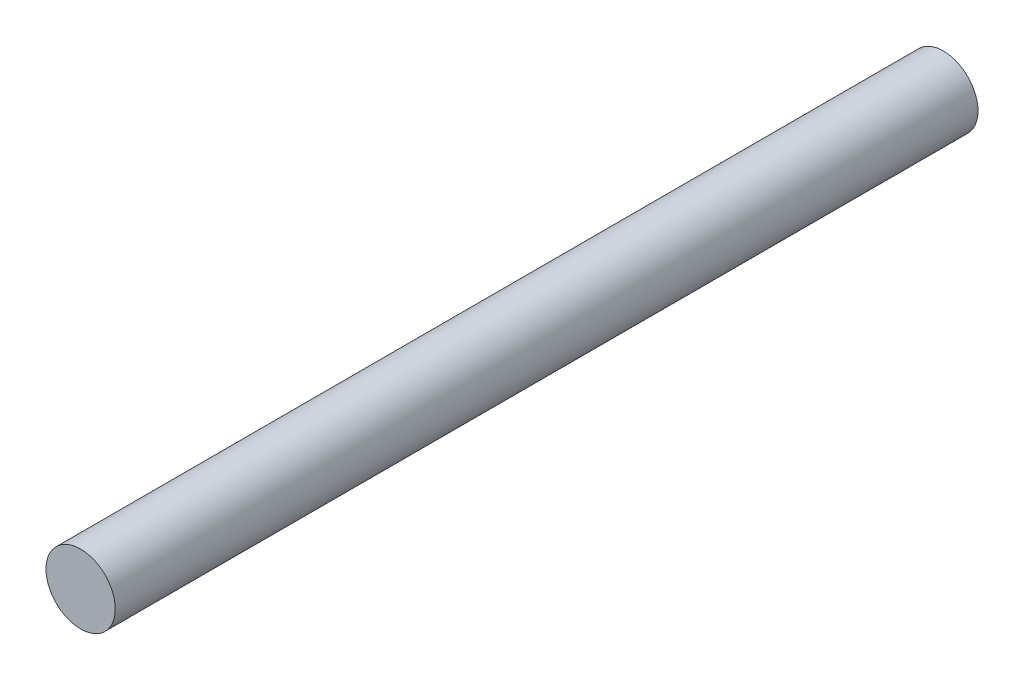
ISO-10303-21;
HEADER;
FILE_DESCRIPTION(('STEP AP214'),'2;1');
FILE_NAME('part.step','',(''),(''),'','','');
FILE_SCHEMA(('AUTOMOTIVE_DESIGN { 1 0 10303 214 1 1 1 1 }'));
ENDSEC;
DATA;
#1=APPLICATION_CONTEXT('core data for automotive mechanical design processes');
#2=APPLICATION_PROTOCOL_DEFINITION('international standard','automotive_design',2000,#1);
#3=PRODUCT_CONTEXT('',#1,'mechanical');
#4=PRODUCT('Part','Part','',(#3));
#5=PRODUCT_RELATED_PRODUCT_CATEGORY('part','',(#4));
#6=PRODUCT_DEFINITION_FORMATION('','',#4);
#7=PRODUCT_DEFINITION_CONTEXT('part definition',#1,'design');
#8=PRODUCT_DEFINITION('design','',#6,#7);
#9=PRODUCT_DEFINITION_SHAPE('','',#8);
#10=(LENGTH_UNIT() NAMED_UNIT(*) SI_UNIT(.MILLI.,.METRE.));
#11=(NAMED_UNIT(*) PLANE_ANGLE_UNIT() SI_UNIT($,.RADIAN.));
#12=(NAMED_UNIT(*) SI_UNIT($,.STERADIAN.) SOLID_ANGLE_UNIT());
#13=UNCERTAINTY_MEASURE_WITH_UNIT(LENGTH_MEASURE(1.E-05),#10,'distance_accuracy_value','');
#14=(GEOMETRIC_REPRESENTATION_CONTEXT(3) GLOBAL_UNCERTAINTY_ASSIGNED_CONTEXT((#13)) GLOBAL_UNIT_ASSIGNED_CONTEXT((#10,
#11,#12)) REPRESENTATION_CONTEXT('',''));
#15=CARTESIAN_POINT('',(0.,0.,0.));
#16=DIRECTION('',(0.,0.,1.));
#17=DIRECTION('',(1.,0.,0.));
#18=AXIS2_PLACEMENT_3D('',#15,#16,#17);
#19=CARTESIAN_POINT('',(-14.,-14.2600688041589,348.8));
#20=DIRECTION('',(0.,0.,1.));
#21=DIRECTION('',(1.,0.,0.));
#22=AXIS2_PLACEMENT_3D('',#19,#20,#21);
#23=PLANE('',#22);
#24=CARTESIAN_POINT('',(0.,0.,348.8));
#25=DIRECTION('',(0.,0.,1.));
#26=DIRECTION('',(-1.,0.,0.));
#27=AXIS2_PLACEMENT_3D('',#24,#25,#26);
#28=CIRCLE('',#27,14.);
#29=CARTESIAN_POINT('',(-14.,0.,348.8));
#30=VERTEX_POINT('',#29);
#31=EDGE_CURVE('E22',#30,#30,#28,.T.);
#32=ORIENTED_EDGE('',*,*,#31,.T.);
#33=EDGE_LOOP('',(#32));
#34=FACE_BOUND('',#33,.T.);
#35=ADVANCED_FACE('F14',(#34),#23,.T.);
#36=CARTESIAN_POINT('',(-14.,-14.2600687880418,0.));
#37=DIRECTION('',(0.,0.,-1.));
#38=DIRECTION('',(0.,1.,0.));
#39=AXIS2_PLACEMENT_3D('',#36,#37,#38);
#40=PLANE('',#39);
#41=CARTESIAN_POINT('',(0.,0.,0.));
#42=DIRECTION('',(0.,0.,-1.));
#43=DIRECTION('',(1.,-1.16851341301429E-09,0.));
#44=AXIS2_PLACEMENT_3D('',#41,#42,#43);
#45=CIRCLE('',#44,14.);
#46=CARTESIAN_POINT('',(14.,-1.63591877822E-08,0.));
#47=VERTEX_POINT('',#46);
#48=EDGE_CURVE('E10',#47,#47,#45,.F.);
#49=ORIENTED_EDGE('',*,*,#48,.F.);
#50=EDGE_LOOP('',(#49));
#51=FACE_BOUND('',#50,.T.);
#52=ADVANCED_FACE('F32',(#51),#40,.T.);
#53=CARTESIAN_POINT('',(0.,0.,348.8));
#54=DIRECTION('',(0.,0.,-1.));
#55=DIRECTION('',(1.,1.16851385268555E-09,0.));
#56=AXIS2_PLACEMENT_3D('',#53,#54,#55);
#57=CYLINDRICAL_SURFACE('',#56,14.);
#58=ORIENTED_EDGE('',*,*,#31,.F.);
#59=EDGE_LOOP('',(#58));
#60=FACE_BOUND('',#59,.T.);
#61=ORIENTED_EDGE('',*,*,#48,.T.);
#62=EDGE_LOOP('',(#61));
#63=FACE_BOUND('',#62,.T.);
#64=ADVANCED_FACE('F16',(#60,#63),#57,.T.);
#65=CLOSED_SHELL('',(#35,#52,#64));
#66=MANIFOLD_SOLID_BREP('B1',#65);
#67=ADVANCED_BREP_SHAPE_REPRESENTATION('',(#18,#66),#14);
#68=SHAPE_DEFINITION_REPRESENTATION(#9,#67);
ENDSEC;
END-ISO-10303-21;
